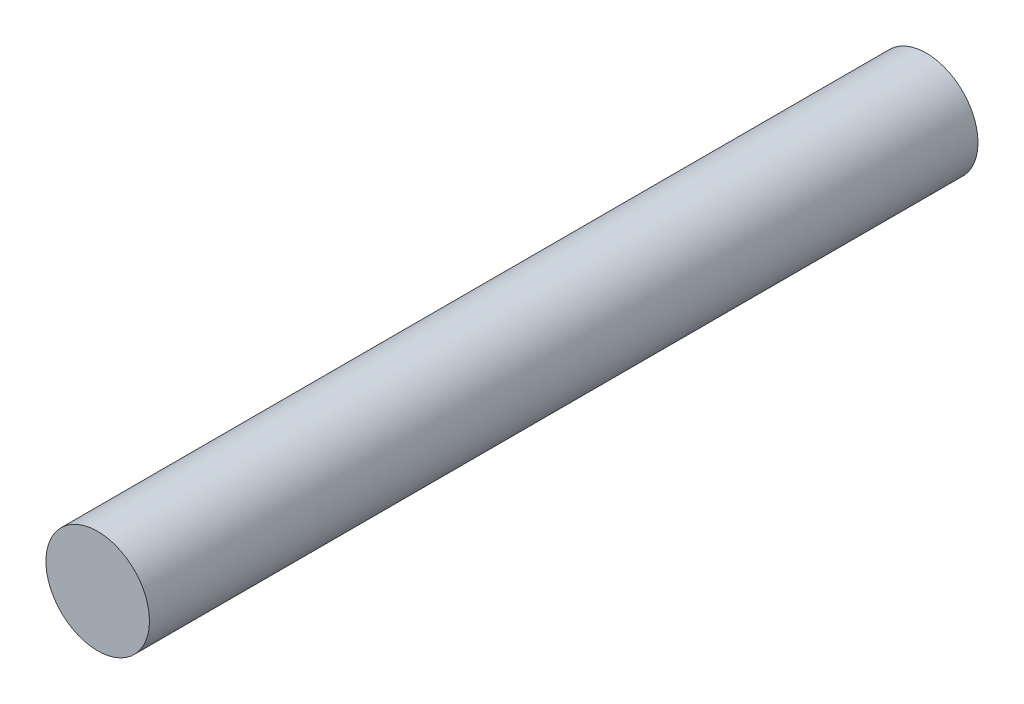
ISO-10303-21;
HEADER;
FILE_DESCRIPTION(('STEP AP214'),'2;1');
FILE_NAME('part.step','',(''),(''),'','','');
FILE_SCHEMA(('AUTOMOTIVE_DESIGN { 1 0 10303 214 1 1 1 1 }'));
ENDSEC;
DATA;
#1=APPLICATION_CONTEXT('core data for automotive mechanical design processes');
#2=APPLICATION_PROTOCOL_DEFINITION('international standard','automotive_design',2000,#1);
#3=PRODUCT_CONTEXT('',#1,'mechanical');
#4=PRODUCT('Part','Part','',(#3));
#5=PRODUCT_RELATED_PRODUCT_CATEGORY('part','',(#4));
#6=PRODUCT_DEFINITION_FORMATION('','',#4);
#7=PRODUCT_DEFINITION_CONTEXT('part definition',#1,'design');
#8=PRODUCT_DEFINITION('design','',#6,#7);
#9=PRODUCT_DEFINITION_SHAPE('','',#8);
#10=(LENGTH_UNIT() NAMED_UNIT(*) SI_UNIT(.MILLI.,.METRE.));
#11=(NAMED_UNIT(*) PLANE_ANGLE_UNIT() SI_UNIT($,.RADIAN.));
#12=(NAMED_UNIT(*) SI_UNIT($,.STERADIAN.) SOLID_ANGLE_UNIT());
#13=UNCERTAINTY_MEASURE_WITH_UNIT(LENGTH_MEASURE(1.E-05),#10,'distance_accuracy_value','');
#14=(GEOMETRIC_REPRESENTATION_CONTEXT(3) GLOBAL_UNCERTAINTY_ASSIGNED_CONTEXT((#13)) GLOBAL_UNIT_ASSIGNED_CONTEXT((#10,
#11,#12)) REPRESENTATION_CONTEXT('',''));
#15=CARTESIAN_POINT('',(0.,0.,0.));
#16=DIRECTION('',(0.,0.,1.));
#17=DIRECTION('',(1.,0.,0.));
#18=AXIS2_PLACEMENT_3D('',#15,#16,#17);
#19=CARTESIAN_POINT('',(0.,0.,4.));
#20=DIRECTION('',(0.,0.,-1.));
#21=DIRECTION('',(-1.,0.,0.));
#22=AXIS2_PLACEMENT_3D('',#19,#20,#21);
#23=CYLINDRICAL_SURFACE('',#22,0.5);
#24=CARTESIAN_POINT('',(0.,0.,4.));
#25=DIRECTION('',(0.,0.,1.));
#26=DIRECTION('',(1.,0.,0.));
#27=AXIS2_PLACEMENT_3D('',#24,#25,#26);
#28=CIRCLE('',#27,0.5);
#29=CARTESIAN_POINT('',(0.5,0.,4.));
#30=VERTEX_POINT('',#29);
#31=EDGE_CURVE('E10',#30,#30,#28,.T.);
#32=ORIENTED_EDGE('',*,*,#31,.F.);
#33=EDGE_LOOP('',(#32));
#34=FACE_BOUND('',#33,.T.);
#35=CARTESIAN_POINT('',(0.,0.,-4.));
#36=DIRECTION('',(0.,0.,1.));
#37=DIRECTION('',(1.,0.,0.));
#38=AXIS2_PLACEMENT_3D('',#35,#36,#37);
#39=CIRCLE('',#38,0.5);
#40=CARTESIAN_POINT('',(0.5,0.,-4.));
#41=VERTEX_POINT('',#40);
#42=EDGE_CURVE('E37',#41,#41,#39,.T.);
#43=ORIENTED_EDGE('',*,*,#42,.T.);
#44=EDGE_LOOP('',(#43));
#45=FACE_BOUND('',#44,.T.);
#46=ADVANCED_FACE('F40',(#34,#45),#23,.T.);
#47=CARTESIAN_POINT('',(0.,0.,4.));
#48=DIRECTION('',(0.,0.,1.));
#49=DIRECTION('',(1.,0.,0.));
#50=AXIS2_PLACEMENT_3D('',#47,#48,#49);
#51=PLANE('',#50);
#52=ORIENTED_EDGE('',*,*,#31,.T.);
#53=EDGE_LOOP('',(#52));
#54=FACE_BOUND('',#53,.T.);
#55=ADVANCED_FACE('F55',(#54),#51,.T.);
#56=CARTESIAN_POINT('',(0.,0.,-4.));
#57=DIRECTION('',(0.,0.,1.));
#58=DIRECTION('',(1.,0.,0.));
#59=AXIS2_PLACEMENT_3D('',#56,#57,#58);
#60=PLANE('',#59);
#61=ORIENTED_EDGE('',*,*,#42,.F.);
#62=EDGE_LOOP('',(#61));
#63=FACE_BOUND('',#62,.T.);
#64=ADVANCED_FACE('F49',(#63),#60,.F.);
#65=CLOSED_SHELL('',(#46,#55,#64));
#66=MANIFOLD_SOLID_BREP('B2',#65);
#67=ADVANCED_BREP_SHAPE_REPRESENTATION('',(#18,#66),#14);
#68=SHAPE_DEFINITION_REPRESENTATION(#9,#67);
ENDSEC;
END-ISO-10303-21;
